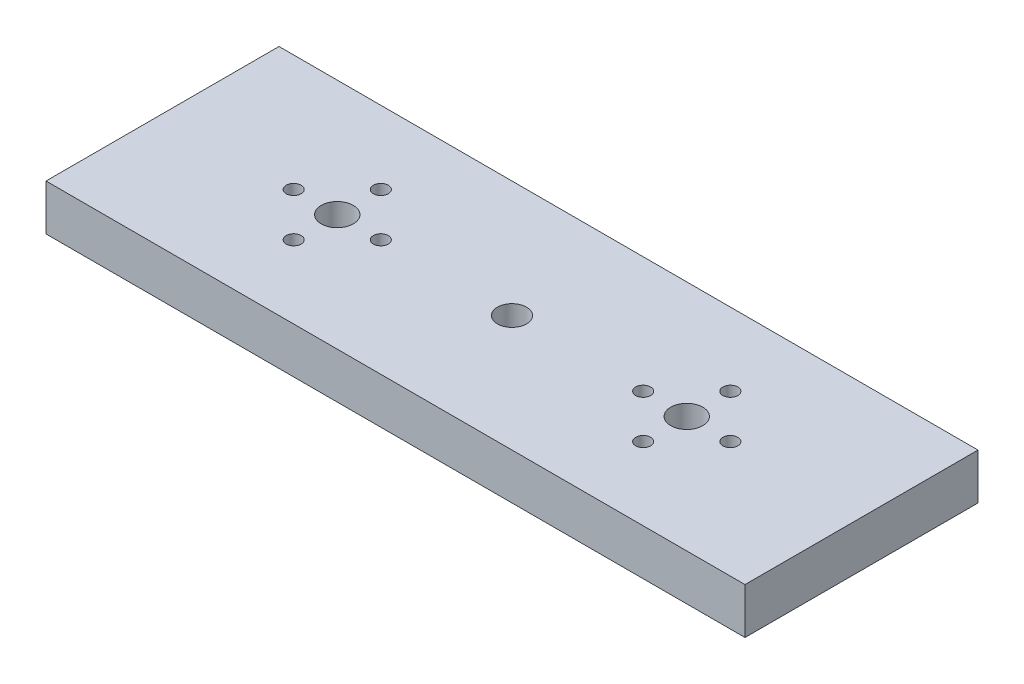
ISO-10303-21;
HEADER;
FILE_DESCRIPTION(('STEP AP214'),'2;1');
FILE_NAME('part.step','',(''),(''),'','','');
FILE_SCHEMA(('AUTOMOTIVE_DESIGN { 1 0 10303 214 1 1 1 1 }'));
ENDSEC;
DATA;
#1=APPLICATION_CONTEXT('core data for automotive mechanical design processes');
#2=APPLICATION_PROTOCOL_DEFINITION('international standard','automotive_design',2000,#1);
#3=PRODUCT_CONTEXT('',#1,'mechanical');
#4=PRODUCT('Part','Part','',(#3));
#5=PRODUCT_RELATED_PRODUCT_CATEGORY('part','',(#4));
#6=PRODUCT_DEFINITION_FORMATION('','',#4);
#7=PRODUCT_DEFINITION_CONTEXT('part definition',#1,'design');
#8=PRODUCT_DEFINITION('design','',#6,#7);
#9=PRODUCT_DEFINITION_SHAPE('','',#8);
#10=(LENGTH_UNIT() NAMED_UNIT(*) SI_UNIT(.MILLI.,.METRE.));
#11=(NAMED_UNIT(*) PLANE_ANGLE_UNIT() SI_UNIT($,.RADIAN.));
#12=(NAMED_UNIT(*) SI_UNIT($,.STERADIAN.) SOLID_ANGLE_UNIT());
#13=UNCERTAINTY_MEASURE_WITH_UNIT(LENGTH_MEASURE(1.E-05),#10,'distance_accuracy_value','');
#14=(GEOMETRIC_REPRESENTATION_CONTEXT(3) GLOBAL_UNCERTAINTY_ASSIGNED_CONTEXT((#13)) GLOBAL_UNIT_ASSIGNED_CONTEXT((#10,
#11,#12)) REPRESENTATION_CONTEXT('',''));
#15=CARTESIAN_POINT('',(0.,0.,0.));
#16=DIRECTION('',(0.,0.,1.));
#17=DIRECTION('',(1.,0.,0.));
#18=AXIS2_PLACEMENT_3D('',#15,#16,#17);
#19=CARTESIAN_POINT('',(0.,20.,0.));
#20=DIRECTION('',(0.,-1.,0.));
#21=DIRECTION('',(0.,0.,-1.));
#22=AXIS2_PLACEMENT_3D('',#19,#20,#21);
#23=PLANE('',#22);
#24=CARTESIAN_POINT('',(76.2,20.,-19.));
#25=DIRECTION('',(0.,1.,0.));
#26=DIRECTION('',(0.,0.,1.));
#27=AXIS2_PLACEMENT_3D('',#24,#25,#26);
#28=CIRCLE('',#27,3.25000000000001);
#29=CARTESIAN_POINT('',(76.2,20.,-15.75));
#30=VERTEX_POINT('',#29);
#31=EDGE_CURVE('E216',#30,#30,#28,.T.);
#32=ORIENTED_EDGE('',*,*,#31,.F.);
#33=EDGE_LOOP('',(#32));
#34=FACE_BOUND('',#33,.T.);
#35=CARTESIAN_POINT('',(57.2,20.,0.));
#36=DIRECTION('',(0.,1.,0.));
#37=DIRECTION('',(1.,0.,0.));
#38=AXIS2_PLACEMENT_3D('',#35,#36,#37);
#39=CIRCLE('',#38,3.25000000000001);
#40=CARTESIAN_POINT('',(60.45,20.,0.));
#41=VERTEX_POINT('',#40);
#42=EDGE_CURVE('E208',#41,#41,#39,.T.);
#43=ORIENTED_EDGE('',*,*,#42,.F.);
#44=EDGE_LOOP('',(#43));
#45=FACE_BOUND('',#44,.T.);
#46=CARTESIAN_POINT('',(76.2,20.,19.));
#47=DIRECTION('',(0.,1.,0.));
#48=DIRECTION('',(0.,0.,-1.));
#49=AXIS2_PLACEMENT_3D('',#46,#47,#48);
#50=CIRCLE('',#49,3.25000000000001);
#51=CARTESIAN_POINT('',(76.2,20.,15.75));
#52=VERTEX_POINT('',#51);
#53=EDGE_CURVE('E200',#52,#52,#50,.T.);
#54=ORIENTED_EDGE('',*,*,#53,.F.);
#55=EDGE_LOOP('',(#54));
#56=FACE_BOUND('',#55,.T.);
#57=CARTESIAN_POINT('',(95.2,20.,-2.35922392732846E-13));
#58=DIRECTION('',(0.,1.,0.));
#59=DIRECTION('',(-1.,0.,0.));
#60=AXIS2_PLACEMENT_3D('',#57,#58,#59);
#61=CIRCLE('',#60,3.25000000000001);
#62=CARTESIAN_POINT('',(91.95,20.,-2.01880449679125E-13));
#63=VERTEX_POINT('',#62);
#64=EDGE_CURVE('E192',#63,#63,#61,.T.);
#65=ORIENTED_EDGE('',*,*,#64,.F.);
#66=EDGE_LOOP('',(#65));
#67=FACE_BOUND('',#66,.T.);
#68=CARTESIAN_POINT('',(-95.2,20.,0.));
#69=DIRECTION('',(0.,1.,0.));
#70=DIRECTION('',(1.,0.,0.));
#71=AXIS2_PLACEMENT_3D('',#68,#69,#70);
#72=CIRCLE('',#71,3.25000000000001);
#73=CARTESIAN_POINT('',(-91.95,20.,0.));
#74=VERTEX_POINT('',#73);
#75=EDGE_CURVE('E185',#74,#74,#72,.T.);
#76=ORIENTED_EDGE('',*,*,#75,.F.);
#77=EDGE_LOOP('',(#76));
#78=FACE_BOUND('',#77,.T.);
#79=CARTESIAN_POINT('',(-76.2,20.,19.));
#80=DIRECTION('',(0.,1.,0.));
#81=DIRECTION('',(0.,0.,-1.));
#82=AXIS2_PLACEMENT_3D('',#79,#80,#81);
#83=CIRCLE('',#82,3.25000000000001);
#84=CARTESIAN_POINT('',(-76.2,20.,15.75));
#85=VERTEX_POINT('',#84);
#86=EDGE_CURVE('E177',#85,#85,#83,.T.);
#87=ORIENTED_EDGE('',*,*,#86,.F.);
#88=EDGE_LOOP('',(#87));
#89=FACE_BOUND('',#88,.T.);
#90=CARTESIAN_POINT('',(-57.2,20.,-2.08166817117217E-13));
#91=DIRECTION('',(0.,1.,0.));
#92=DIRECTION('',(-1.,0.,0.));
#93=AXIS2_PLACEMENT_3D('',#90,#91,#92);
#94=CIRCLE('',#93,3.25000000000001);
#95=CARTESIAN_POINT('',(-60.45,20.,-1.74124874063496E-13));
#96=VERTEX_POINT('',#95);
#97=EDGE_CURVE('E168',#96,#96,#94,.T.);
#98=ORIENTED_EDGE('',*,*,#97,.F.);
#99=EDGE_LOOP('',(#98));
#100=FACE_BOUND('',#99,.T.);
#101=CARTESIAN_POINT('',(-76.2,20.,-19.));
#102=DIRECTION('',(0.,1.,0.));
#103=DIRECTION('',(0.,0.,1.));
#104=AXIS2_PLACEMENT_3D('',#101,#102,#103);
#105=CIRCLE('',#104,3.25000000000001);
#106=CARTESIAN_POINT('',(-76.2,20.,-15.75));
#107=VERTEX_POINT('',#106);
#108=EDGE_CURVE('E160',#107,#107,#105,.T.);
#109=ORIENTED_EDGE('',*,*,#108,.F.);
#110=EDGE_LOOP('',(#109));
#111=FACE_BOUND('',#110,.T.);
#112=DIRECTION('',(0.,0.,1.));
#113=VECTOR('',#112,1.);
#114=CARTESIAN_POINT('',(-152.4,20.,-50.8));
#115=LINE('',#114,#113);
#116=CARTESIAN_POINT('',(-152.4,20.,-50.8));
#117=VERTEX_POINT('',#116);
#118=CARTESIAN_POINT('',(-152.4,20.,50.8));
#119=VERTEX_POINT('',#118);
#120=EDGE_CURVE('E98',#117,#119,#115,.T.);
#121=ORIENTED_EDGE('',*,*,#120,.T.);
#122=DIRECTION('',(1.,0.,0.));
#123=VECTOR('',#122,1.);
#124=CARTESIAN_POINT('',(152.4,20.,50.8));
#125=LINE('',#124,#123);
#126=CARTESIAN_POINT('',(152.4,20.,50.8));
#127=VERTEX_POINT('',#126);
#128=EDGE_CURVE('E93',#119,#127,#125,.T.);
#129=ORIENTED_EDGE('',*,*,#128,.T.);
#130=DIRECTION('',(0.,0.,-1.));
#131=VECTOR('',#130,1.);
#132=CARTESIAN_POINT('',(152.4,20.,-50.8));
#133=LINE('',#132,#131);
#134=CARTESIAN_POINT('',(152.4,20.,-50.8));
#135=VERTEX_POINT('',#134);
#136=EDGE_CURVE('E96',#127,#135,#133,.T.);
#137=ORIENTED_EDGE('',*,*,#136,.T.);
#138=DIRECTION('',(-1.,0.,0.));
#139=VECTOR('',#138,1.);
#140=CARTESIAN_POINT('',(152.4,20.,-50.8));
#141=LINE('',#140,#139);
#142=EDGE_CURVE('E63',#135,#117,#141,.T.);
#143=ORIENTED_EDGE('',*,*,#142,.T.);
#144=EDGE_LOOP('',(#121,#129,#137,#143));
#145=FACE_BOUND('',#144,.T.);
#146=CARTESIAN_POINT('',(0.,20.,0.));
#147=DIRECTION('',(0.,1.,0.));
#148=DIRECTION('',(0.,0.,1.));
#149=AXIS2_PLACEMENT_3D('',#146,#147,#148);
#150=CIRCLE('',#149,6.35);
#151=CARTESIAN_POINT('',(0.,20.,6.34999999999999));
#152=VERTEX_POINT('',#151);
#153=EDGE_CURVE('E118',#152,#152,#150,.T.);
#154=ORIENTED_EDGE('',*,*,#153,.F.);
#155=EDGE_LOOP('',(#154));
#156=FACE_BOUND('',#155,.T.);
#157=CARTESIAN_POINT('',(-76.2,20.,0.));
#158=DIRECTION('',(0.,1.,0.));
#159=DIRECTION('',(0.,0.,1.));
#160=AXIS2_PLACEMENT_3D('',#157,#158,#159);
#161=CIRCLE('',#160,7.);
#162=CARTESIAN_POINT('',(-76.2,20.,6.99999999999998));
#163=VERTEX_POINT('',#162);
#164=EDGE_CURVE('E140',#163,#163,#161,.T.);
#165=ORIENTED_EDGE('',*,*,#164,.F.);
#166=EDGE_LOOP('',(#165));
#167=FACE_BOUND('',#166,.T.);
#168=CARTESIAN_POINT('',(76.2,20.,0.));
#169=DIRECTION('',(0.,1.,0.));
#170=DIRECTION('',(0.,0.,1.));
#171=AXIS2_PLACEMENT_3D('',#168,#169,#170);
#172=CIRCLE('',#171,7.);
#173=CARTESIAN_POINT('',(76.2,20.,6.99999999999999));
#174=VERTEX_POINT('',#173);
#175=EDGE_CURVE('E148',#174,#174,#172,.T.);
#176=ORIENTED_EDGE('',*,*,#175,.F.);
#177=EDGE_LOOP('',(#176));
#178=FACE_BOUND('',#177,.T.);
#179=ADVANCED_FACE('F45',(#34,#45,#56,#67,#78,#89,#100,#111,#145,#156,#167,#178),#23,.F.);
#180=CARTESIAN_POINT('',(0.,0.,0.));
#181=DIRECTION('',(0.,-1.,0.));
#182=DIRECTION('',(0.,0.,-1.));
#183=AXIS2_PLACEMENT_3D('',#180,#181,#182);
#184=PLANE('',#183);
#185=CARTESIAN_POINT('',(76.2,0.,-19.));
#186=DIRECTION('',(0.,1.,0.));
#187=DIRECTION('',(0.,0.,1.));
#188=AXIS2_PLACEMENT_3D('',#185,#186,#187);
#189=CIRCLE('',#188,3.25000000000001);
#190=CARTESIAN_POINT('',(76.2,0.,-15.75));
#191=VERTEX_POINT('',#190);
#192=EDGE_CURVE('E173',#191,#191,#189,.T.);
#193=ORIENTED_EDGE('',*,*,#192,.T.);
#194=EDGE_LOOP('',(#193));
#195=FACE_BOUND('',#194,.T.);
#196=CARTESIAN_POINT('',(57.2,0.,0.));
#197=DIRECTION('',(0.,1.,0.));
#198=DIRECTION('',(1.,0.,0.));
#199=AXIS2_PLACEMENT_3D('',#196,#197,#198);
#200=CIRCLE('',#199,3.25000000000001);
#201=CARTESIAN_POINT('',(60.45,0.,0.));
#202=VERTEX_POINT('',#201);
#203=EDGE_CURVE('E212',#202,#202,#200,.T.);
#204=ORIENTED_EDGE('',*,*,#203,.T.);
#205=EDGE_LOOP('',(#204));
#206=FACE_BOUND('',#205,.T.);
#207=CARTESIAN_POINT('',(76.2,0.,19.));
#208=DIRECTION('',(0.,1.,0.));
#209=DIRECTION('',(0.,0.,-1.));
#210=AXIS2_PLACEMENT_3D('',#207,#208,#209);
#211=CIRCLE('',#210,3.25000000000001);
#212=CARTESIAN_POINT('',(76.2,0.,15.75));
#213=VERTEX_POINT('',#212);
#214=EDGE_CURVE('E204',#213,#213,#211,.T.);
#215=ORIENTED_EDGE('',*,*,#214,.T.);
#216=EDGE_LOOP('',(#215));
#217=FACE_BOUND('',#216,.T.);
#218=CARTESIAN_POINT('',(95.2,0.,-2.35922392732846E-13));
#219=DIRECTION('',(0.,1.,0.));
#220=DIRECTION('',(-1.,0.,0.));
#221=AXIS2_PLACEMENT_3D('',#218,#219,#220);
#222=CIRCLE('',#221,3.25000000000001);
#223=CARTESIAN_POINT('',(91.95,0.,-2.01880449679125E-13));
#224=VERTEX_POINT('',#223);
#225=EDGE_CURVE('E196',#224,#224,#222,.T.);
#226=ORIENTED_EDGE('',*,*,#225,.T.);
#227=EDGE_LOOP('',(#226));
#228=FACE_BOUND('',#227,.T.);
#229=CARTESIAN_POINT('',(-95.2,0.,0.));
#230=DIRECTION('',(0.,1.,0.));
#231=DIRECTION('',(1.,0.,0.));
#232=AXIS2_PLACEMENT_3D('',#229,#230,#231);
#233=CIRCLE('',#232,3.25000000000001);
#234=CARTESIAN_POINT('',(-91.95,0.,0.));
#235=VERTEX_POINT('',#234);
#236=EDGE_CURVE('E164',#235,#235,#233,.T.);
#237=ORIENTED_EDGE('',*,*,#236,.T.);
#238=EDGE_LOOP('',(#237));
#239=FACE_BOUND('',#238,.T.);
#240=CARTESIAN_POINT('',(-76.2,0.,19.));
#241=DIRECTION('',(0.,1.,0.));
#242=DIRECTION('',(0.,0.,-1.));
#243=AXIS2_PLACEMENT_3D('',#240,#241,#242);
#244=CIRCLE('',#243,3.25000000000001);
#245=CARTESIAN_POINT('',(-76.2,0.,15.75));
#246=VERTEX_POINT('',#245);
#247=EDGE_CURVE('E181',#246,#246,#244,.T.);
#248=ORIENTED_EDGE('',*,*,#247,.T.);
#249=EDGE_LOOP('',(#248));
#250=FACE_BOUND('',#249,.T.);
#251=CARTESIAN_POINT('',(-57.2,0.,-2.08166817117217E-13));
#252=DIRECTION('',(0.,1.,0.));
#253=DIRECTION('',(-1.,0.,0.));
#254=AXIS2_PLACEMENT_3D('',#251,#252,#253);
#255=CIRCLE('',#254,3.25000000000001);
#256=CARTESIAN_POINT('',(-60.45,0.,-1.74124874063496E-13));
#257=VERTEX_POINT('',#256);
#258=EDGE_CURVE('E172',#257,#257,#255,.T.);
#259=ORIENTED_EDGE('',*,*,#258,.T.);
#260=EDGE_LOOP('',(#259));
#261=FACE_BOUND('',#260,.T.);
#262=CARTESIAN_POINT('',(-76.2,0.,-19.));
#263=DIRECTION('',(0.,1.,0.));
#264=DIRECTION('',(0.,0.,1.));
#265=AXIS2_PLACEMENT_3D('',#262,#263,#264);
#266=CIRCLE('',#265,3.25000000000001);
#267=CARTESIAN_POINT('',(-76.2,0.,-15.75));
#268=VERTEX_POINT('',#267);
#269=EDGE_CURVE('E156',#268,#268,#266,.T.);
#270=ORIENTED_EDGE('',*,*,#269,.T.);
#271=EDGE_LOOP('',(#270));
#272=FACE_BOUND('',#271,.T.);
#273=CARTESIAN_POINT('',(-76.2,0.,0.));
#274=DIRECTION('',(0.,1.,0.));
#275=DIRECTION('',(0.,0.,1.));
#276=AXIS2_PLACEMENT_3D('',#273,#274,#275);
#277=CIRCLE('',#276,7.);
#278=CARTESIAN_POINT('',(-76.2,0.,6.99999999999998));
#279=VERTEX_POINT('',#278);
#280=EDGE_CURVE('E144',#279,#279,#277,.T.);
#281=ORIENTED_EDGE('',*,*,#280,.T.);
#282=EDGE_LOOP('',(#281));
#283=FACE_BOUND('',#282,.T.);
#284=DIRECTION('',(0.,0.,1.));
#285=VECTOR('',#284,1.);
#286=CARTESIAN_POINT('',(-152.4,0.,-50.8));
#287=LINE('',#286,#285);
#288=CARTESIAN_POINT('',(-152.4,0.,-50.8));
#289=VERTEX_POINT('',#288);
#290=CARTESIAN_POINT('',(-152.4,0.,50.8));
#291=VERTEX_POINT('',#290);
#292=EDGE_CURVE('E114',#289,#291,#287,.T.);
#293=ORIENTED_EDGE('',*,*,#292,.F.);
#294=DIRECTION('',(-1.,0.,0.));
#295=VECTOR('',#294,1.);
#296=CARTESIAN_POINT('',(152.4,0.,-50.8));
#297=LINE('',#296,#295);
#298=CARTESIAN_POINT('',(152.4,0.,-50.8));
#299=VERTEX_POINT('',#298);
#300=EDGE_CURVE('E86',#299,#289,#297,.T.);
#301=ORIENTED_EDGE('',*,*,#300,.F.);
#302=DIRECTION('',(0.,0.,-1.));
#303=VECTOR('',#302,1.);
#304=CARTESIAN_POINT('',(152.4,0.,-50.8));
#305=LINE('',#304,#303);
#306=CARTESIAN_POINT('',(152.4,0.,50.8));
#307=VERTEX_POINT('',#306);
#308=EDGE_CURVE('E80',#307,#299,#305,.T.);
#309=ORIENTED_EDGE('',*,*,#308,.F.);
#310=DIRECTION('',(1.,0.,0.));
#311=VECTOR('',#310,1.);
#312=CARTESIAN_POINT('',(152.4,0.,50.8));
#313=LINE('',#312,#311);
#314=EDGE_CURVE('E103',#291,#307,#313,.T.);
#315=ORIENTED_EDGE('',*,*,#314,.F.);
#316=EDGE_LOOP('',(#293,#301,#309,#315));
#317=FACE_BOUND('',#316,.T.);
#318=CARTESIAN_POINT('',(0.,0.,0.));
#319=DIRECTION('',(0.,1.,0.));
#320=DIRECTION('',(0.,0.,1.));
#321=AXIS2_PLACEMENT_3D('',#318,#319,#320);
#322=CIRCLE('',#321,6.35);
#323=CARTESIAN_POINT('',(0.,0.,6.34999999999999));
#324=VERTEX_POINT('',#323);
#325=EDGE_CURVE('E136',#324,#324,#322,.T.);
#326=ORIENTED_EDGE('',*,*,#325,.T.);
#327=EDGE_LOOP('',(#326));
#328=FACE_BOUND('',#327,.T.);
#329=CARTESIAN_POINT('',(76.2,0.,0.));
#330=DIRECTION('',(0.,1.,0.));
#331=DIRECTION('',(0.,0.,1.));
#332=AXIS2_PLACEMENT_3D('',#329,#330,#331);
#333=CIRCLE('',#332,7.);
#334=CARTESIAN_POINT('',(76.2,0.,6.99999999999999));
#335=VERTEX_POINT('',#334);
#336=EDGE_CURVE('E152',#335,#335,#333,.T.);
#337=ORIENTED_EDGE('',*,*,#336,.T.);
#338=EDGE_LOOP('',(#337));
#339=FACE_BOUND('',#338,.T.);
#340=ADVANCED_FACE('F131',(#195,#206,#217,#228,#239,#250,#261,#272,#283,#317,#328,#339),#184,.T.);
#341=CARTESIAN_POINT('',(-152.4,20.,-50.8));
#342=DIRECTION('',(1.,0.,0.));
#343=DIRECTION('',(0.,0.,-1.));
#344=AXIS2_PLACEMENT_3D('',#341,#342,#343);
#345=PLANE('',#344);
#346=ORIENTED_EDGE('',*,*,#292,.T.);
#347=DIRECTION('',(0.,-1.,0.));
#348=VECTOR('',#347,1.);
#349=CARTESIAN_POINT('',(-152.4,20.,50.8));
#350=LINE('',#349,#348);
#351=EDGE_CURVE('E11',#119,#291,#350,.T.);
#352=ORIENTED_EDGE('',*,*,#351,.F.);
#353=ORIENTED_EDGE('',*,*,#120,.F.);
#354=DIRECTION('',(0.,-1.,0.));
#355=VECTOR('',#354,1.);
#356=CARTESIAN_POINT('',(-152.4,20.,-50.8));
#357=LINE('',#356,#355);
#358=EDGE_CURVE('E110',#117,#289,#357,.T.);
#359=ORIENTED_EDGE('',*,*,#358,.T.);
#360=EDGE_LOOP('',(#346,#352,#353,#359));
#361=FACE_BOUND('',#360,.T.);
#362=ADVANCED_FACE('F47',(#361),#345,.F.);
#363=CARTESIAN_POINT('',(152.4,20.,50.8));
#364=DIRECTION('',(0.,0.,-1.));
#365=DIRECTION('',(-1.,0.,0.));
#366=AXIS2_PLACEMENT_3D('',#363,#364,#365);
#367=PLANE('',#366);
#368=ORIENTED_EDGE('',*,*,#314,.T.);
#369=DIRECTION('',(0.,-1.,0.));
#370=VECTOR('',#369,1.);
#371=CARTESIAN_POINT('',(152.4,20.,50.8));
#372=LINE('',#371,#370);
#373=EDGE_CURVE('E55',#127,#307,#372,.T.);
#374=ORIENTED_EDGE('',*,*,#373,.F.);
#375=ORIENTED_EDGE('',*,*,#128,.F.);
#376=ORIENTED_EDGE('',*,*,#351,.T.);
#377=EDGE_LOOP('',(#368,#374,#375,#376));
#378=FACE_BOUND('',#377,.T.);
#379=ADVANCED_FACE('F102',(#378),#367,.F.);
#380=CARTESIAN_POINT('',(152.4,20.,-50.8));
#381=DIRECTION('',(-1.,0.,0.));
#382=DIRECTION('',(0.,0.,1.));
#383=AXIS2_PLACEMENT_3D('',#380,#381,#382);
#384=PLANE('',#383);
#385=ORIENTED_EDGE('',*,*,#308,.T.);
#386=DIRECTION('',(0.,-1.,0.));
#387=VECTOR('',#386,1.);
#388=CARTESIAN_POINT('',(152.4,20.,-50.8));
#389=LINE('',#388,#387);
#390=EDGE_CURVE('E105',#135,#299,#389,.T.);
#391=ORIENTED_EDGE('',*,*,#390,.F.);
#392=ORIENTED_EDGE('',*,*,#136,.F.);
#393=ORIENTED_EDGE('',*,*,#373,.T.);
#394=EDGE_LOOP('',(#385,#391,#392,#393));
#395=FACE_BOUND('',#394,.T.);
#396=ADVANCED_FACE('F106',(#395),#384,.F.);
#397=CARTESIAN_POINT('',(152.4,20.,-50.8));
#398=DIRECTION('',(0.,0.,1.));
#399=DIRECTION('',(1.,0.,0.));
#400=AXIS2_PLACEMENT_3D('',#397,#398,#399);
#401=PLANE('',#400);
#402=ORIENTED_EDGE('',*,*,#300,.T.);
#403=ORIENTED_EDGE('',*,*,#358,.F.);
#404=ORIENTED_EDGE('',*,*,#142,.F.);
#405=ORIENTED_EDGE('',*,*,#390,.T.);
#406=EDGE_LOOP('',(#402,#403,#404,#405));
#407=FACE_BOUND('',#406,.T.);
#408=ADVANCED_FACE('F128',(#407),#401,.F.);
#409=CARTESIAN_POINT('',(0.,20.,0.));
#410=DIRECTION('',(0.,-1.,0.));
#411=DIRECTION('',(0.,0.,-1.));
#412=AXIS2_PLACEMENT_3D('',#409,#410,#411);
#413=CYLINDRICAL_SURFACE('',#412,6.35);
#414=ORIENTED_EDGE('',*,*,#153,.T.);
#415=EDGE_LOOP('',(#414));
#416=FACE_BOUND('',#415,.T.);
#417=ORIENTED_EDGE('',*,*,#325,.F.);
#418=EDGE_LOOP('',(#417));
#419=FACE_BOUND('',#418,.T.);
#420=ADVANCED_FACE('F271',(#416,#419),#413,.F.);
#421=CARTESIAN_POINT('',(-76.2,20.,0.));
#422=DIRECTION('',(0.,-1.,0.));
#423=DIRECTION('',(0.,0.,-1.));
#424=AXIS2_PLACEMENT_3D('',#421,#422,#423);
#425=CYLINDRICAL_SURFACE('',#424,7.);
#426=ORIENTED_EDGE('',*,*,#164,.T.);
#427=EDGE_LOOP('',(#426));
#428=FACE_BOUND('',#427,.T.);
#429=ORIENTED_EDGE('',*,*,#280,.F.);
#430=EDGE_LOOP('',(#429));
#431=FACE_BOUND('',#430,.T.);
#432=ADVANCED_FACE('F263',(#428,#431),#425,.F.);
#433=CARTESIAN_POINT('',(76.2,20.,0.));
#434=DIRECTION('',(0.,-1.,0.));
#435=DIRECTION('',(0.,0.,-1.));
#436=AXIS2_PLACEMENT_3D('',#433,#434,#435);
#437=CYLINDRICAL_SURFACE('',#436,7.);
#438=ORIENTED_EDGE('',*,*,#175,.T.);
#439=EDGE_LOOP('',(#438));
#440=FACE_BOUND('',#439,.T.);
#441=ORIENTED_EDGE('',*,*,#336,.F.);
#442=EDGE_LOOP('',(#441));
#443=FACE_BOUND('',#442,.T.);
#444=ADVANCED_FACE('F253',(#440,#443),#437,.F.);
#445=CARTESIAN_POINT('',(-76.2,0.,-19.));
#446=DIRECTION('',(0.,1.,0.));
#447=DIRECTION('',(0.,0.,1.));
#448=AXIS2_PLACEMENT_3D('',#445,#446,#447);
#449=CYLINDRICAL_SURFACE('',#448,3.25000000000001);
#450=ORIENTED_EDGE('',*,*,#269,.F.);
#451=EDGE_LOOP('',(#450));
#452=FACE_BOUND('',#451,.T.);
#453=ORIENTED_EDGE('',*,*,#108,.T.);
#454=EDGE_LOOP('',(#453));
#455=FACE_BOUND('',#454,.T.);
#456=ADVANCED_FACE('F250',(#452,#455),#449,.F.);
#457=CARTESIAN_POINT('',(-57.2,0.,-2.08166817117217E-13));
#458=DIRECTION('',(0.,1.,0.));
#459=DIRECTION('',(0.,0.,1.));
#460=AXIS2_PLACEMENT_3D('',#457,#458,#459);
#461=CYLINDRICAL_SURFACE('',#460,3.25000000000001);
#462=ORIENTED_EDGE('',*,*,#258,.F.);
#463=EDGE_LOOP('',(#462));
#464=FACE_BOUND('',#463,.T.);
#465=ORIENTED_EDGE('',*,*,#97,.T.);
#466=EDGE_LOOP('',(#465));
#467=FACE_BOUND('',#466,.T.);
#468=ADVANCED_FACE('F252',(#464,#467),#461,.F.);
#469=CARTESIAN_POINT('',(-76.2,0.,19.));
#470=DIRECTION('',(0.,1.,0.));
#471=DIRECTION('',(0.,0.,1.));
#472=AXIS2_PLACEMENT_3D('',#469,#470,#471);
#473=CYLINDRICAL_SURFACE('',#472,3.25000000000001);
#474=ORIENTED_EDGE('',*,*,#247,.F.);
#475=EDGE_LOOP('',(#474));
#476=FACE_BOUND('',#475,.T.);
#477=ORIENTED_EDGE('',*,*,#86,.T.);
#478=EDGE_LOOP('',(#477));
#479=FACE_BOUND('',#478,.T.);
#480=ADVANCED_FACE('F260',(#476,#479),#473,.F.);
#481=CARTESIAN_POINT('',(-95.2,0.,0.));
#482=DIRECTION('',(0.,1.,0.));
#483=DIRECTION('',(0.,0.,1.));
#484=AXIS2_PLACEMENT_3D('',#481,#482,#483);
#485=CYLINDRICAL_SURFACE('',#484,3.25000000000001);
#486=ORIENTED_EDGE('',*,*,#236,.F.);
#487=EDGE_LOOP('',(#486));
#488=FACE_BOUND('',#487,.T.);
#489=ORIENTED_EDGE('',*,*,#75,.T.);
#490=EDGE_LOOP('',(#489));
#491=FACE_BOUND('',#490,.T.);
#492=ADVANCED_FACE('F346',(#488,#491),#485,.F.);
#493=CARTESIAN_POINT('',(95.2,0.,-2.35922392732846E-13));
#494=DIRECTION('',(0.,1.,0.));
#495=DIRECTION('',(0.,0.,1.));
#496=AXIS2_PLACEMENT_3D('',#493,#494,#495);
#497=CYLINDRICAL_SURFACE('',#496,3.25000000000001);
#498=ORIENTED_EDGE('',*,*,#225,.F.);
#499=EDGE_LOOP('',(#498));
#500=FACE_BOUND('',#499,.T.);
#501=ORIENTED_EDGE('',*,*,#64,.T.);
#502=EDGE_LOOP('',(#501));
#503=FACE_BOUND('',#502,.T.);
#504=ADVANCED_FACE('F355',(#500,#503),#497,.F.);
#505=CARTESIAN_POINT('',(76.2,0.,19.));
#506=DIRECTION('',(0.,1.,0.));
#507=DIRECTION('',(0.,0.,1.));
#508=AXIS2_PLACEMENT_3D('',#505,#506,#507);
#509=CYLINDRICAL_SURFACE('',#508,3.25000000000001);
#510=ORIENTED_EDGE('',*,*,#214,.F.);
#511=EDGE_LOOP('',(#510));
#512=FACE_BOUND('',#511,.T.);
#513=ORIENTED_EDGE('',*,*,#53,.T.);
#514=EDGE_LOOP('',(#513));
#515=FACE_BOUND('',#514,.T.);
#516=ADVANCED_FACE('F365',(#512,#515),#509,.F.);
#517=CARTESIAN_POINT('',(57.2,0.,0.));
#518=DIRECTION('',(0.,1.,0.));
#519=DIRECTION('',(0.,0.,1.));
#520=AXIS2_PLACEMENT_3D('',#517,#518,#519);
#521=CYLINDRICAL_SURFACE('',#520,3.25000000000001);
#522=ORIENTED_EDGE('',*,*,#203,.F.);
#523=EDGE_LOOP('',(#522));
#524=FACE_BOUND('',#523,.T.);
#525=ORIENTED_EDGE('',*,*,#42,.T.);
#526=EDGE_LOOP('',(#525));
#527=FACE_BOUND('',#526,.T.);
#528=ADVANCED_FACE('F229',(#524,#527),#521,.F.);
#529=CARTESIAN_POINT('',(76.2,0.,-19.));
#530=DIRECTION('',(0.,1.,0.));
#531=DIRECTION('',(0.,0.,1.));
#532=AXIS2_PLACEMENT_3D('',#529,#530,#531);
#533=CYLINDRICAL_SURFACE('',#532,3.25000000000001);
#534=ORIENTED_EDGE('',*,*,#192,.F.);
#535=EDGE_LOOP('',(#534));
#536=FACE_BOUND('',#535,.T.);
#537=ORIENTED_EDGE('',*,*,#31,.T.);
#538=EDGE_LOOP('',(#537));
#539=FACE_BOUND('',#538,.T.);
#540=ADVANCED_FACE('F226',(#536,#539),#533,.F.);
#541=CLOSED_SHELL('',(#179,#340,#362,#379,#396,#408,#420,#432,#444,#456,#468,#480,#492,#504,
#516,#528,#540));
#542=MANIFOLD_SOLID_BREP('B2',#541);
#543=ADVANCED_BREP_SHAPE_REPRESENTATION('',(#18,#542),#14);
#544=SHAPE_DEFINITION_REPRESENTATION(#9,#543);
ENDSEC;
END-ISO-10303-21;
